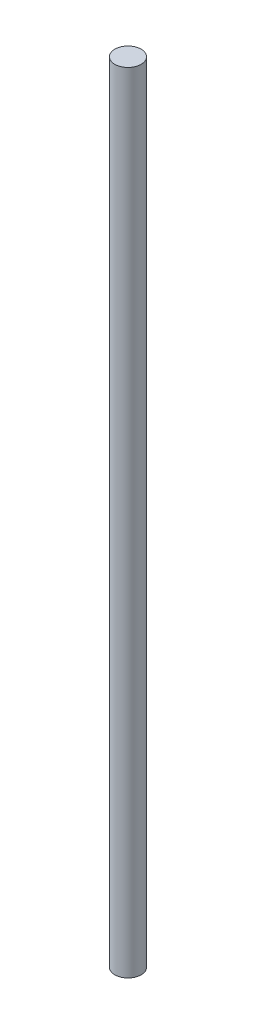
ISO-10303-21;
HEADER;
FILE_DESCRIPTION(('STEP AP214'),'2;1');
FILE_NAME('part.step','',(''),(''),'','','');
FILE_SCHEMA(('AUTOMOTIVE_DESIGN { 1 0 10303 214 1 1 1 1 }'));
ENDSEC;
DATA;
#1=APPLICATION_CONTEXT('core data for automotive mechanical design processes');
#2=APPLICATION_PROTOCOL_DEFINITION('international standard','automotive_design',2000,#1);
#3=PRODUCT_CONTEXT('',#1,'mechanical');
#4=PRODUCT('Part','Part','',(#3));
#5=PRODUCT_RELATED_PRODUCT_CATEGORY('part','',(#4));
#6=PRODUCT_DEFINITION_FORMATION('','',#4);
#7=PRODUCT_DEFINITION_CONTEXT('part definition',#1,'design');
#8=PRODUCT_DEFINITION('design','',#6,#7);
#9=PRODUCT_DEFINITION_SHAPE('','',#8);
#10=(LENGTH_UNIT() NAMED_UNIT(*) SI_UNIT(.MILLI.,.METRE.));
#11=(NAMED_UNIT(*) PLANE_ANGLE_UNIT() SI_UNIT($,.RADIAN.));
#12=(NAMED_UNIT(*) SI_UNIT($,.STERADIAN.) SOLID_ANGLE_UNIT());
#13=UNCERTAINTY_MEASURE_WITH_UNIT(LENGTH_MEASURE(1.E-05),#10,'distance_accuracy_value','');
#14=(GEOMETRIC_REPRESENTATION_CONTEXT(3) GLOBAL_UNCERTAINTY_ASSIGNED_CONTEXT((#13)) GLOBAL_UNIT_ASSIGNED_CONTEXT((#10,
#11,#12)) REPRESENTATION_CONTEXT('',''));
#15=CARTESIAN_POINT('',(0.,0.,0.));
#16=DIRECTION('',(0.,0.,1.));
#17=DIRECTION('',(1.,0.,0.));
#18=AXIS2_PLACEMENT_3D('',#15,#16,#17);
#19=CARTESIAN_POINT('',(0.,75.,0.));
#20=DIRECTION('',(0.,-1.,0.));
#21=DIRECTION('',(0.,0.,-1.));
#22=AXIS2_PLACEMENT_3D('',#19,#20,#21);
#23=CYLINDRICAL_SURFACE('',#22,2.5);
#24=CARTESIAN_POINT('',(0.,75.,0.));
#25=DIRECTION('',(0.,1.,0.));
#26=DIRECTION('',(0.,0.,1.));
#27=AXIS2_PLACEMENT_3D('',#24,#25,#26);
#28=CIRCLE('',#27,2.5);
#29=CARTESIAN_POINT('',(0.,75.,2.5));
#30=VERTEX_POINT('',#29);
#31=EDGE_CURVE('E10',#30,#30,#28,.T.);
#32=ORIENTED_EDGE('',*,*,#31,.F.);
#33=EDGE_LOOP('',(#32));
#34=FACE_BOUND('',#33,.T.);
#35=CARTESIAN_POINT('',(0.,-75.,0.));
#36=DIRECTION('',(0.,1.,0.));
#37=DIRECTION('',(0.,0.,1.));
#38=AXIS2_PLACEMENT_3D('',#35,#36,#37);
#39=CIRCLE('',#38,2.5);
#40=CARTESIAN_POINT('',(0.,-75.,2.5));
#41=VERTEX_POINT('',#40);
#42=EDGE_CURVE('E44',#41,#41,#39,.T.);
#43=ORIENTED_EDGE('',*,*,#42,.T.);
#44=EDGE_LOOP('',(#43));
#45=FACE_BOUND('',#44,.T.);
#46=ADVANCED_FACE('F41',(#34,#45),#23,.T.);
#47=CARTESIAN_POINT('',(0.,75.,0.));
#48=DIRECTION('',(0.,1.,0.));
#49=DIRECTION('',(0.,0.,1.));
#50=AXIS2_PLACEMENT_3D('',#47,#48,#49);
#51=PLANE('',#50);
#52=ORIENTED_EDGE('',*,*,#31,.T.);
#53=EDGE_LOOP('',(#52));
#54=FACE_BOUND('',#53,.T.);
#55=ADVANCED_FACE('F58',(#54),#51,.T.);
#56=CARTESIAN_POINT('',(0.,-75.,0.));
#57=DIRECTION('',(0.,1.,0.));
#58=DIRECTION('',(0.,0.,1.));
#59=AXIS2_PLACEMENT_3D('',#56,#57,#58);
#60=PLANE('',#59);
#61=ORIENTED_EDGE('',*,*,#42,.F.);
#62=EDGE_LOOP('',(#61));
#63=FACE_BOUND('',#62,.T.);
#64=ADVANCED_FACE('F56',(#63),#60,.F.);
#65=CLOSED_SHELL('',(#46,#55,#64));
#66=MANIFOLD_SOLID_BREP('B2',#65);
#67=ADVANCED_BREP_SHAPE_REPRESENTATION('',(#18,#66),#14);
#68=SHAPE_DEFINITION_REPRESENTATION(#9,#67);
ENDSEC;
END-ISO-10303-21;
